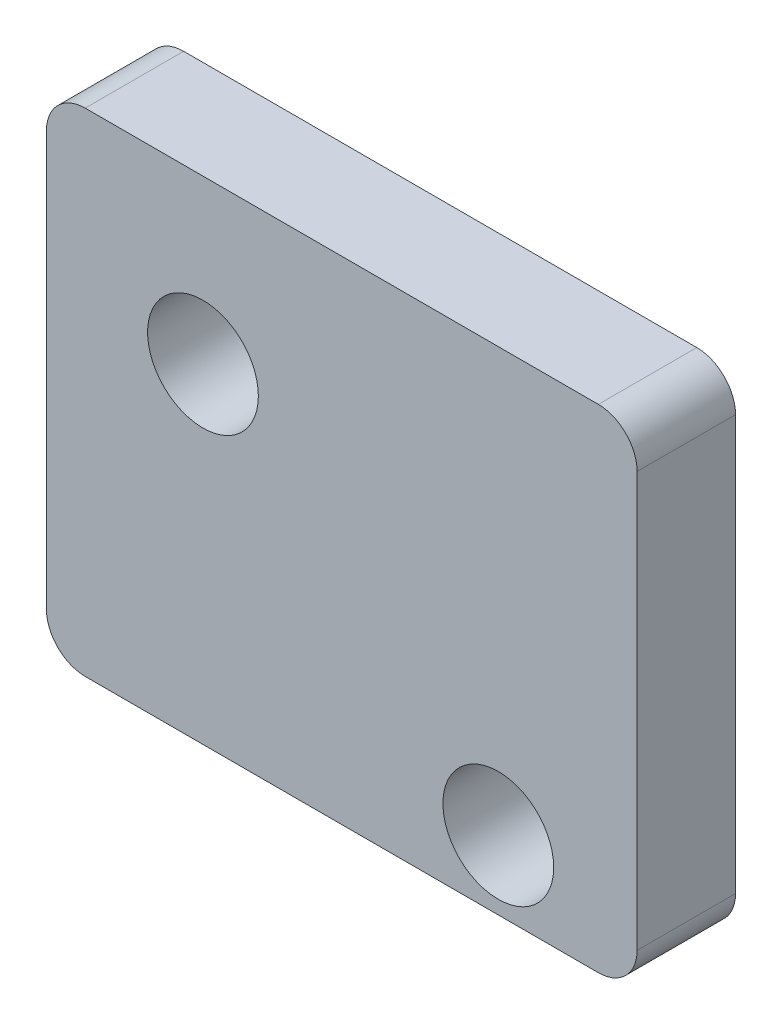
ISO-10303-21;
HEADER;
FILE_DESCRIPTION(('STEP AP214'),'2;1');
FILE_NAME('part.step','',(''),(''),'','','');
FILE_SCHEMA(('AUTOMOTIVE_DESIGN { 1 0 10303 214 1 1 1 1 }'));
ENDSEC;
DATA;
#1=APPLICATION_CONTEXT('core data for automotive mechanical design processes');
#2=APPLICATION_PROTOCOL_DEFINITION('international standard','automotive_design',2000,#1);
#3=PRODUCT_CONTEXT('',#1,'mechanical');
#4=PRODUCT('Part','Part','',(#3));
#5=PRODUCT_RELATED_PRODUCT_CATEGORY('part','',(#4));
#6=PRODUCT_DEFINITION_FORMATION('','',#4);
#7=PRODUCT_DEFINITION_CONTEXT('part definition',#1,'design');
#8=PRODUCT_DEFINITION('design','',#6,#7);
#9=PRODUCT_DEFINITION_SHAPE('','',#8);
#10=(LENGTH_UNIT() NAMED_UNIT(*) SI_UNIT(.MILLI.,.METRE.));
#11=(NAMED_UNIT(*) PLANE_ANGLE_UNIT() SI_UNIT($,.RADIAN.));
#12=(NAMED_UNIT(*) SI_UNIT($,.STERADIAN.) SOLID_ANGLE_UNIT());
#13=UNCERTAINTY_MEASURE_WITH_UNIT(LENGTH_MEASURE(1.E-05),#10,'distance_accuracy_value','');
#14=(GEOMETRIC_REPRESENTATION_CONTEXT(3) GLOBAL_UNCERTAINTY_ASSIGNED_CONTEXT((#13)) GLOBAL_UNIT_ASSIGNED_CONTEXT((#10,
#11,#12)) REPRESENTATION_CONTEXT('',''));
#15=CARTESIAN_POINT('',(0.,0.,0.));
#16=DIRECTION('',(0.,0.,1.));
#17=DIRECTION('',(1.,0.,0.));
#18=AXIS2_PLACEMENT_3D('',#15,#16,#17);
#19=CARTESIAN_POINT('',(0.,0.,25.4));
#20=DIRECTION('',(0.,0.,1.));
#21=DIRECTION('',(1.,0.,0.));
#22=AXIS2_PLACEMENT_3D('',#19,#20,#21);
#23=PLANE('',#22);
#24=CARTESIAN_POINT('',(40.3860328506942,-42.0179166989594,25.4));
#25=DIRECTION('',(0.,0.,1.));
#26=DIRECTION('',(1.,0.,0.));
#27=AXIS2_PLACEMENT_3D('',#24,#25,#26);
#28=CIRCLE('',#27,14.2875);
#29=CARTESIAN_POINT('',(54.6735328506942,-42.0179166989594,25.4));
#30=VERTEX_POINT('',#29);
#31=EDGE_CURVE('E170',#30,#30,#28,.T.);
#32=ORIENTED_EDGE('',*,*,#31,.F.);
#33=EDGE_LOOP('',(#32));
#34=FACE_BOUND('',#33,.T.);
#35=DIRECTION('',(0.,1.,0.));
#36=VECTOR('',#35,1.);
#37=CARTESIAN_POINT('',(152.4,0.,25.4));
#38=LINE('',#37,#36);
#39=CARTESIAN_POINT('',(152.4,-117.,25.4));
#40=VERTEX_POINT('',#39);
#41=CARTESIAN_POINT('',(152.4,-9.99999999999999,25.4));
#42=VERTEX_POINT('',#41);
#43=EDGE_CURVE('E177',#40,#42,#38,.T.);
#44=ORIENTED_EDGE('',*,*,#43,.T.);
#45=CARTESIAN_POINT('',(142.4,-10.,25.4));
#46=DIRECTION('',(0.,0.,1.));
#47=DIRECTION('',(1.,0.,0.));
#48=AXIS2_PLACEMENT_3D('',#45,#46,#47);
#49=CIRCLE('',#48,10.);
#50=CARTESIAN_POINT('',(142.4,0.,25.4));
#51=VERTEX_POINT('',#50);
#52=EDGE_CURVE('E154',#42,#51,#49,.T.);
#53=ORIENTED_EDGE('',*,*,#52,.T.);
#54=DIRECTION('',(-1.,0.,0.));
#55=VECTOR('',#54,1.);
#56=CARTESIAN_POINT('',(0.,0.,25.4));
#57=LINE('',#56,#55);
#58=CARTESIAN_POINT('',(10.,0.,25.4));
#59=VERTEX_POINT('',#58);
#60=EDGE_CURVE('E125',#51,#59,#57,.T.);
#61=ORIENTED_EDGE('',*,*,#60,.T.);
#62=CARTESIAN_POINT('',(10.,-10.,25.4));
#63=DIRECTION('',(0.,0.,1.));
#64=DIRECTION('',(1.,0.,0.));
#65=AXIS2_PLACEMENT_3D('',#62,#63,#64);
#66=CIRCLE('',#65,10.);
#67=CARTESIAN_POINT('',(0.,-10.,25.4));
#68=VERTEX_POINT('',#67);
#69=EDGE_CURVE('E149',#59,#68,#66,.T.);
#70=ORIENTED_EDGE('',*,*,#69,.T.);
#71=DIRECTION('',(0.,-1.,0.));
#72=VECTOR('',#71,1.);
#73=CARTESIAN_POINT('',(0.,0.,25.4));
#74=LINE('',#73,#72);
#75=CARTESIAN_POINT('',(0.,-117.,25.4));
#76=VERTEX_POINT('',#75);
#77=EDGE_CURVE('E132',#68,#76,#74,.T.);
#78=ORIENTED_EDGE('',*,*,#77,.T.);
#79=CARTESIAN_POINT('',(10.,-117.,25.4));
#80=DIRECTION('',(0.,0.,1.));
#81=DIRECTION('',(1.,0.,0.));
#82=AXIS2_PLACEMENT_3D('',#79,#80,#81);
#83=CIRCLE('',#82,10.);
#84=CARTESIAN_POINT('',(10.,-127.,25.4));
#85=VERTEX_POINT('',#84);
#86=EDGE_CURVE('E61',#76,#85,#83,.T.);
#87=ORIENTED_EDGE('',*,*,#86,.T.);
#88=DIRECTION('',(1.,0.,0.));
#89=VECTOR('',#88,1.);
#90=CARTESIAN_POINT('',(0.,-127.,25.4));
#91=LINE('',#90,#89);
#92=CARTESIAN_POINT('',(142.4,-127.,25.4));
#93=VERTEX_POINT('',#92);
#94=EDGE_CURVE('E135',#85,#93,#91,.T.);
#95=ORIENTED_EDGE('',*,*,#94,.T.);
#96=CARTESIAN_POINT('',(142.4,-117.,25.4));
#97=DIRECTION('',(0.,0.,1.));
#98=DIRECTION('',(1.,0.,0.));
#99=AXIS2_PLACEMENT_3D('',#96,#97,#98);
#100=CIRCLE('',#99,10.);
#101=EDGE_CURVE('E152',#93,#40,#100,.T.);
#102=ORIENTED_EDGE('',*,*,#101,.T.);
#103=EDGE_LOOP('',(#44,#53,#61,#70,#78,#87,#95,#102));
#104=FACE_BOUND('',#103,.T.);
#105=CARTESIAN_POINT('',(116.586032850694,-109.22,25.4));
#106=DIRECTION('',(0.,0.,1.));
#107=DIRECTION('',(1.,0.,0.));
#108=AXIS2_PLACEMENT_3D('',#105,#106,#107);
#109=CIRCLE('',#108,14.2875);
#110=CARTESIAN_POINT('',(130.873532850694,-109.22,25.4));
#111=VERTEX_POINT('',#110);
#112=EDGE_CURVE('E182',#111,#111,#109,.T.);
#113=ORIENTED_EDGE('',*,*,#112,.F.);
#114=EDGE_LOOP('',(#113));
#115=FACE_BOUND('',#114,.T.);
#116=ADVANCED_FACE('F39',(#34,#104,#115),#23,.T.);
#117=CARTESIAN_POINT('',(0.,0.,0.));
#118=DIRECTION('',(0.,0.,1.));
#119=DIRECTION('',(1.,0.,0.));
#120=AXIS2_PLACEMENT_3D('',#117,#118,#119);
#121=PLANE('',#120);
#122=DIRECTION('',(-1.,0.,0.));
#123=VECTOR('',#122,1.);
#124=CARTESIAN_POINT('',(0.,0.,0.));
#125=LINE('',#124,#123);
#126=CARTESIAN_POINT('',(142.4,0.,0.));
#127=VERTEX_POINT('',#126);
#128=CARTESIAN_POINT('',(10.,0.,0.));
#129=VERTEX_POINT('',#128);
#130=EDGE_CURVE('E122',#127,#129,#125,.T.);
#131=ORIENTED_EDGE('',*,*,#130,.F.);
#132=CARTESIAN_POINT('',(142.4,-10.,0.));
#133=DIRECTION('',(0.,0.,1.));
#134=DIRECTION('',(1.,0.,0.));
#135=AXIS2_PLACEMENT_3D('',#132,#133,#134);
#136=CIRCLE('',#135,10.);
#137=CARTESIAN_POINT('',(152.4,-9.99999999999999,0.));
#138=VERTEX_POINT('',#137);
#139=EDGE_CURVE('E105',#127,#138,#136,.F.);
#140=ORIENTED_EDGE('',*,*,#139,.T.);
#141=DIRECTION('',(0.,1.,0.));
#142=VECTOR('',#141,1.);
#143=CARTESIAN_POINT('',(152.4,0.,0.));
#144=LINE('',#143,#142);
#145=CARTESIAN_POINT('',(152.4,-117.,0.));
#146=VERTEX_POINT('',#145);
#147=EDGE_CURVE('E133',#146,#138,#144,.T.);
#148=ORIENTED_EDGE('',*,*,#147,.F.);
#149=CARTESIAN_POINT('',(142.4,-117.,0.));
#150=DIRECTION('',(0.,0.,1.));
#151=DIRECTION('',(1.,0.,0.));
#152=AXIS2_PLACEMENT_3D('',#149,#150,#151);
#153=CIRCLE('',#152,10.);
#154=CARTESIAN_POINT('',(142.4,-127.,0.));
#155=VERTEX_POINT('',#154);
#156=EDGE_CURVE('E116',#146,#155,#153,.F.);
#157=ORIENTED_EDGE('',*,*,#156,.T.);
#158=DIRECTION('',(1.,0.,0.));
#159=VECTOR('',#158,1.);
#160=CARTESIAN_POINT('',(0.,-127.,0.));
#161=LINE('',#160,#159);
#162=CARTESIAN_POINT('',(10.,-127.,0.));
#163=VERTEX_POINT('',#162);
#164=EDGE_CURVE('E137',#163,#155,#161,.T.);
#165=ORIENTED_EDGE('',*,*,#164,.F.);
#166=CARTESIAN_POINT('',(10.,-117.,0.));
#167=DIRECTION('',(0.,0.,1.));
#168=DIRECTION('',(1.,0.,0.));
#169=AXIS2_PLACEMENT_3D('',#166,#167,#168);
#170=CIRCLE('',#169,10.);
#171=CARTESIAN_POINT('',(0.,-117.,0.));
#172=VERTEX_POINT('',#171);
#173=EDGE_CURVE('E143',#163,#172,#170,.F.);
#174=ORIENTED_EDGE('',*,*,#173,.T.);
#175=DIRECTION('',(0.,-1.,0.));
#176=VECTOR('',#175,1.);
#177=CARTESIAN_POINT('',(0.,0.,0.));
#178=LINE('',#177,#176);
#179=CARTESIAN_POINT('',(0.,-10.,0.));
#180=VERTEX_POINT('',#179);
#181=EDGE_CURVE('E165',#180,#172,#178,.T.);
#182=ORIENTED_EDGE('',*,*,#181,.F.);
#183=CARTESIAN_POINT('',(10.,-10.,0.));
#184=DIRECTION('',(0.,0.,1.));
#185=DIRECTION('',(1.,0.,0.));
#186=AXIS2_PLACEMENT_3D('',#183,#184,#185);
#187=CIRCLE('',#186,10.);
#188=EDGE_CURVE('E126',#180,#129,#187,.F.);
#189=ORIENTED_EDGE('',*,*,#188,.T.);
#190=EDGE_LOOP('',(#131,#140,#148,#157,#165,#174,#182,#189));
#191=FACE_BOUND('',#190,.T.);
#192=CARTESIAN_POINT('',(40.3860328506942,-42.0179166989594,0.));
#193=DIRECTION('',(0.,0.,1.));
#194=DIRECTION('',(1.,0.,0.));
#195=AXIS2_PLACEMENT_3D('',#192,#193,#194);
#196=CIRCLE('',#195,14.2875);
#197=CARTESIAN_POINT('',(54.6735328506942,-42.0179166989594,0.));
#198=VERTEX_POINT('',#197);
#199=EDGE_CURVE('E173',#198,#198,#196,.T.);
#200=ORIENTED_EDGE('',*,*,#199,.T.);
#201=EDGE_LOOP('',(#200));
#202=FACE_BOUND('',#201,.T.);
#203=CARTESIAN_POINT('',(116.586032850694,-109.22,0.));
#204=DIRECTION('',(0.,0.,1.));
#205=DIRECTION('',(1.,0.,0.));
#206=AXIS2_PLACEMENT_3D('',#203,#204,#205);
#207=CIRCLE('',#206,14.2875);
#208=CARTESIAN_POINT('',(130.873532850694,-109.22,0.));
#209=VERTEX_POINT('',#208);
#210=EDGE_CURVE('E184',#209,#209,#207,.T.);
#211=ORIENTED_EDGE('',*,*,#210,.T.);
#212=EDGE_LOOP('',(#211));
#213=FACE_BOUND('',#212,.T.);
#214=ADVANCED_FACE('F129',(#191,#202,#213),#121,.F.);
#215=CARTESIAN_POINT('',(0.,0.,25.4));
#216=DIRECTION('',(1.,0.,0.));
#217=DIRECTION('',(0.,1.,0.));
#218=AXIS2_PLACEMENT_3D('',#215,#216,#217);
#219=PLANE('',#218);
#220=ORIENTED_EDGE('',*,*,#181,.T.);
#221=DIRECTION('',(0.,0.,-1.));
#222=VECTOR('',#221,1.);
#223=CARTESIAN_POINT('',(0.,-117.,25.4));
#224=LINE('',#223,#222);
#225=EDGE_CURVE('E11',#172,#76,#224,.F.);
#226=ORIENTED_EDGE('',*,*,#225,.T.);
#227=ORIENTED_EDGE('',*,*,#77,.F.);
#228=DIRECTION('',(0.,0.,-1.));
#229=VECTOR('',#228,1.);
#230=CARTESIAN_POINT('',(0.,-10.,25.4));
#231=LINE('',#230,#229);
#232=EDGE_CURVE('E47',#68,#180,#231,.T.);
#233=ORIENTED_EDGE('',*,*,#232,.T.);
#234=EDGE_LOOP('',(#220,#226,#227,#233));
#235=FACE_BOUND('',#234,.T.);
#236=ADVANCED_FACE('F164',(#235),#219,.F.);
#237=CARTESIAN_POINT('',(0.,-127.,25.4));
#238=DIRECTION('',(0.,1.,0.));
#239=DIRECTION('',(0.,0.,1.));
#240=AXIS2_PLACEMENT_3D('',#237,#238,#239);
#241=PLANE('',#240);
#242=ORIENTED_EDGE('',*,*,#164,.T.);
#243=DIRECTION('',(0.,0.,-1.));
#244=VECTOR('',#243,1.);
#245=CARTESIAN_POINT('',(142.4,-127.,25.4));
#246=LINE('',#245,#244);
#247=EDGE_CURVE('E54',#155,#93,#246,.F.);
#248=ORIENTED_EDGE('',*,*,#247,.T.);
#249=ORIENTED_EDGE('',*,*,#94,.F.);
#250=DIRECTION('',(0.,0.,-1.));
#251=VECTOR('',#250,1.);
#252=CARTESIAN_POINT('',(10.,-127.,25.4));
#253=LINE('',#252,#251);
#254=EDGE_CURVE('E156',#85,#163,#253,.T.);
#255=ORIENTED_EDGE('',*,*,#254,.T.);
#256=EDGE_LOOP('',(#242,#248,#249,#255));
#257=FACE_BOUND('',#256,.T.);
#258=ADVANCED_FACE('F211',(#257),#241,.F.);
#259=CARTESIAN_POINT('',(152.4,0.,25.4));
#260=DIRECTION('',(-1.,0.,0.));
#261=DIRECTION('',(0.,-1.,0.));
#262=AXIS2_PLACEMENT_3D('',#259,#260,#261);
#263=PLANE('',#262);
#264=ORIENTED_EDGE('',*,*,#147,.T.);
#265=DIRECTION('',(0.,0.,-1.));
#266=VECTOR('',#265,1.);
#267=CARTESIAN_POINT('',(152.4,-9.99999999999999,25.4));
#268=LINE('',#267,#266);
#269=EDGE_CURVE('E110',#138,#42,#268,.F.);
#270=ORIENTED_EDGE('',*,*,#269,.T.);
#271=ORIENTED_EDGE('',*,*,#43,.F.);
#272=DIRECTION('',(0.,0.,-1.));
#273=VECTOR('',#272,1.);
#274=CARTESIAN_POINT('',(152.4,-117.,25.4));
#275=LINE('',#274,#273);
#276=EDGE_CURVE('E115',#40,#146,#275,.T.);
#277=ORIENTED_EDGE('',*,*,#276,.T.);
#278=EDGE_LOOP('',(#264,#270,#271,#277));
#279=FACE_BOUND('',#278,.T.);
#280=ADVANCED_FACE('F208',(#279),#263,.F.);
#281=CARTESIAN_POINT('',(0.,0.,25.4));
#282=DIRECTION('',(0.,-1.,0.));
#283=DIRECTION('',(0.,0.,-1.));
#284=AXIS2_PLACEMENT_3D('',#281,#282,#283);
#285=PLANE('',#284);
#286=ORIENTED_EDGE('',*,*,#60,.F.);
#287=DIRECTION('',(0.,0.,-1.));
#288=VECTOR('',#287,1.);
#289=CARTESIAN_POINT('',(142.4,0.,25.4));
#290=LINE('',#289,#288);
#291=EDGE_CURVE('E109',#51,#127,#290,.T.);
#292=ORIENTED_EDGE('',*,*,#291,.T.);
#293=ORIENTED_EDGE('',*,*,#130,.T.);
#294=DIRECTION('',(0.,0.,-1.));
#295=VECTOR('',#294,1.);
#296=CARTESIAN_POINT('',(10.,0.,25.4));
#297=LINE('',#296,#295);
#298=EDGE_CURVE('E127',#129,#59,#297,.F.);
#299=ORIENTED_EDGE('',*,*,#298,.T.);
#300=EDGE_LOOP('',(#286,#292,#293,#299));
#301=FACE_BOUND('',#300,.T.);
#302=ADVANCED_FACE('F121',(#301),#285,.F.);
#303=CARTESIAN_POINT('',(40.3860328506942,-42.0179166989594,25.4));
#304=DIRECTION('',(0.,0.,-1.));
#305=DIRECTION('',(-1.,0.,0.));
#306=AXIS2_PLACEMENT_3D('',#303,#304,#305);
#307=CYLINDRICAL_SURFACE('',#306,14.2875);
#308=ORIENTED_EDGE('',*,*,#31,.T.);
#309=EDGE_LOOP('',(#308));
#310=FACE_BOUND('',#309,.T.);
#311=ORIENTED_EDGE('',*,*,#199,.F.);
#312=EDGE_LOOP('',(#311));
#313=FACE_BOUND('',#312,.T.);
#314=ADVANCED_FACE('F203',(#310,#313),#307,.F.);
#315=CARTESIAN_POINT('',(116.586032850694,-109.22,25.4));
#316=DIRECTION('',(0.,0.,-1.));
#317=DIRECTION('',(-1.,0.,0.));
#318=AXIS2_PLACEMENT_3D('',#315,#316,#317);
#319=CYLINDRICAL_SURFACE('',#318,14.2875);
#320=ORIENTED_EDGE('',*,*,#112,.T.);
#321=EDGE_LOOP('',(#320));
#322=FACE_BOUND('',#321,.T.);
#323=ORIENTED_EDGE('',*,*,#210,.F.);
#324=EDGE_LOOP('',(#323));
#325=FACE_BOUND('',#324,.T.);
#326=ADVANCED_FACE('F190',(#322,#325),#319,.F.);
#327=CARTESIAN_POINT('',(142.4,-10.,25.4));
#328=DIRECTION('',(0.,0.,-1.));
#329=DIRECTION('',(-1.,0.,0.));
#330=AXIS2_PLACEMENT_3D('',#327,#328,#329);
#331=CYLINDRICAL_SURFACE('',#330,10.);
#332=ORIENTED_EDGE('',*,*,#52,.F.);
#333=ORIENTED_EDGE('',*,*,#269,.F.);
#334=ORIENTED_EDGE('',*,*,#139,.F.);
#335=ORIENTED_EDGE('',*,*,#291,.F.);
#336=EDGE_LOOP('',(#332,#333,#334,#335));
#337=FACE_BOUND('',#336,.T.);
#338=ADVANCED_FACE('F108',(#337),#331,.T.);
#339=CARTESIAN_POINT('',(142.4,-117.,25.4));
#340=DIRECTION('',(0.,0.,-1.));
#341=DIRECTION('',(-1.,0.,0.));
#342=AXIS2_PLACEMENT_3D('',#339,#340,#341);
#343=CYLINDRICAL_SURFACE('',#342,10.);
#344=ORIENTED_EDGE('',*,*,#101,.F.);
#345=ORIENTED_EDGE('',*,*,#247,.F.);
#346=ORIENTED_EDGE('',*,*,#156,.F.);
#347=ORIENTED_EDGE('',*,*,#276,.F.);
#348=EDGE_LOOP('',(#344,#345,#346,#347));
#349=FACE_BOUND('',#348,.T.);
#350=ADVANCED_FACE('F219',(#349),#343,.T.);
#351=CARTESIAN_POINT('',(10.,-117.,25.4));
#352=DIRECTION('',(0.,0.,-1.));
#353=DIRECTION('',(-1.,0.,0.));
#354=AXIS2_PLACEMENT_3D('',#351,#352,#353);
#355=CYLINDRICAL_SURFACE('',#354,10.);
#356=ORIENTED_EDGE('',*,*,#86,.F.);
#357=ORIENTED_EDGE('',*,*,#225,.F.);
#358=ORIENTED_EDGE('',*,*,#173,.F.);
#359=ORIENTED_EDGE('',*,*,#254,.F.);
#360=EDGE_LOOP('',(#356,#357,#358,#359));
#361=FACE_BOUND('',#360,.T.);
#362=ADVANCED_FACE('F221',(#361),#355,.T.);
#363=CARTESIAN_POINT('',(10.,-10.,25.4));
#364=DIRECTION('',(0.,0.,-1.));
#365=DIRECTION('',(-1.,0.,0.));
#366=AXIS2_PLACEMENT_3D('',#363,#364,#365);
#367=CYLINDRICAL_SURFACE('',#366,10.);
#368=ORIENTED_EDGE('',*,*,#69,.F.);
#369=ORIENTED_EDGE('',*,*,#298,.F.);
#370=ORIENTED_EDGE('',*,*,#188,.F.);
#371=ORIENTED_EDGE('',*,*,#232,.F.);
#372=EDGE_LOOP('',(#368,#369,#370,#371));
#373=FACE_BOUND('',#372,.T.);
#374=ADVANCED_FACE('F41',(#373),#367,.T.);
#375=CLOSED_SHELL('',(#116,#214,#236,#258,#280,#302,#314,#326,#338,#350,#362,#374));
#376=MANIFOLD_SOLID_BREP('B2',#375);
#377=ADVANCED_BREP_SHAPE_REPRESENTATION('',(#18,#376),#14);
#378=SHAPE_DEFINITION_REPRESENTATION(#9,#377);
ENDSEC;
END-ISO-10303-21;
